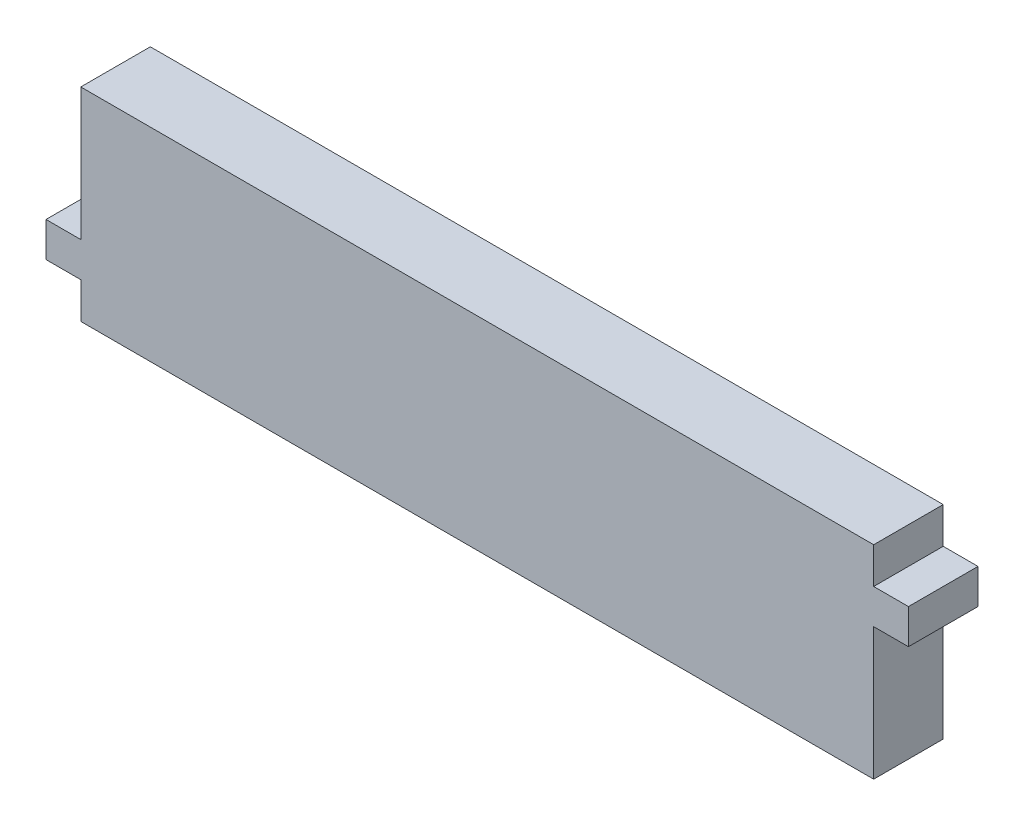
ISO-10303-21;
HEADER;
FILE_DESCRIPTION(('STEP AP214'),'2;1');
FILE_NAME('part.step','',(''),(''),'','','');
FILE_SCHEMA(('AUTOMOTIVE_DESIGN { 1 0 10303 214 1 1 1 1 }'));
ENDSEC;
DATA;
#1=APPLICATION_CONTEXT('core data for automotive mechanical design processes');
#2=APPLICATION_PROTOCOL_DEFINITION('international standard','automotive_design',2000,#1);
#3=PRODUCT_CONTEXT('',#1,'mechanical');
#4=PRODUCT('Part','Part','',(#3));
#5=PRODUCT_RELATED_PRODUCT_CATEGORY('part','',(#4));
#6=PRODUCT_DEFINITION_FORMATION('','',#4);
#7=PRODUCT_DEFINITION_CONTEXT('part definition',#1,'design');
#8=PRODUCT_DEFINITION('design','',#6,#7);
#9=PRODUCT_DEFINITION_SHAPE('','',#8);
#10=(LENGTH_UNIT() NAMED_UNIT(*) SI_UNIT(.MILLI.,.METRE.));
#11=(NAMED_UNIT(*) PLANE_ANGLE_UNIT() SI_UNIT($,.RADIAN.));
#12=(NAMED_UNIT(*) SI_UNIT($,.STERADIAN.) SOLID_ANGLE_UNIT());
#13=UNCERTAINTY_MEASURE_WITH_UNIT(LENGTH_MEASURE(1.E-05),#10,'distance_accuracy_value','');
#14=(GEOMETRIC_REPRESENTATION_CONTEXT(3) GLOBAL_UNCERTAINTY_ASSIGNED_CONTEXT((#13)) GLOBAL_UNIT_ASSIGNED_CONTEXT((#10,
#11,#12)) REPRESENTATION_CONTEXT('',''));
#15=CARTESIAN_POINT('',(0.,0.,0.));
#16=DIRECTION('',(0.,0.,1.));
#17=DIRECTION('',(1.,0.,0.));
#18=AXIS2_PLACEMENT_3D('',#15,#16,#17);
#19=CARTESIAN_POINT('',(129.113772097214,-14.4852674981757,87.2437164679681));
#20=DIRECTION('',(-1.,0.,0.));
#21=DIRECTION('',(0.,0.,1.));
#22=AXIS2_PLACEMENT_3D('',#19,#20,#21);
#23=PLANE('',#22);
#24=DIRECTION('',(0.,1.,0.));
#25=VECTOR('',#24,1.);
#26=CARTESIAN_POINT('',(129.113772097214,-14.4852674981757,6.35000000000004));
#27=LINE('',#26,#25);
#28=CARTESIAN_POINT('',(129.113772097214,-14.4852674981757,6.35000000000004));
#29=VERTEX_POINT('',#28);
#30=CARTESIAN_POINT('',(129.113772097214,-11.1832674981757,6.35000000000004));
#31=VERTEX_POINT('',#30);
#32=EDGE_CURVE('E167',#29,#31,#27,.T.);
#33=ORIENTED_EDGE('',*,*,#32,.F.);
#34=DIRECTION('',(0.,0.,-1.));
#35=VECTOR('',#34,1.);
#36=CARTESIAN_POINT('',(129.113772097214,-14.4852674981757,87.2437164679681));
#37=LINE('',#36,#35);
#38=CARTESIAN_POINT('',(129.113772097214,-14.4852674981757,0.));
#39=VERTEX_POINT('',#38);
#40=EDGE_CURVE('E36',#29,#39,#37,.T.);
#41=ORIENTED_EDGE('',*,*,#40,.T.);
#42=DIRECTION('',(0.,1.,0.));
#43=VECTOR('',#42,1.);
#44=CARTESIAN_POINT('',(129.113772097214,-14.4852674981757,0.));
#45=LINE('',#44,#43);
#46=CARTESIAN_POINT('',(129.113772097214,-11.1832674981757,0.));
#47=VERTEX_POINT('',#46);
#48=EDGE_CURVE('E175',#39,#47,#45,.T.);
#49=ORIENTED_EDGE('',*,*,#48,.T.);
#50=DIRECTION('',(0.,0.,-1.));
#51=VECTOR('',#50,1.);
#52=CARTESIAN_POINT('',(129.113772097214,-11.1832674981757,87.2437164679681));
#53=LINE('',#52,#51);
#54=EDGE_CURVE('E103',#31,#47,#53,.T.);
#55=ORIENTED_EDGE('',*,*,#54,.F.);
#56=EDGE_LOOP('',(#33,#41,#49,#55));
#57=FACE_BOUND('',#56,.T.);
#58=ADVANCED_FACE('F32',(#57),#23,.F.);
#59=CARTESIAN_POINT('',(56.7237720972143,-11.1832674981757,87.2437164679681));
#60=DIRECTION('',(0.,-1.,0.));
#61=DIRECTION('',(0.,0.,-1.));
#62=AXIS2_PLACEMENT_3D('',#59,#60,#61);
#63=PLANE('',#62);
#64=DIRECTION('',(-1.,0.,0.));
#65=VECTOR('',#64,1.);
#66=CARTESIAN_POINT('',(56.7237720972143,-11.1832674981757,6.35000000000004));
#67=LINE('',#66,#65);
#68=CARTESIAN_POINT('',(56.7237720972143,-11.1832674981757,6.35000000000004));
#69=VERTEX_POINT('',#68);
#70=EDGE_CURVE('E110',#31,#69,#67,.T.);
#71=ORIENTED_EDGE('',*,*,#70,.F.);
#72=ORIENTED_EDGE('',*,*,#54,.T.);
#73=DIRECTION('',(-1.,0.,0.));
#74=VECTOR('',#73,1.);
#75=CARTESIAN_POINT('',(56.7237720972143,-11.1832674981757,0.));
#76=LINE('',#75,#74);
#77=CARTESIAN_POINT('',(56.7237720972143,-11.1832674981757,0.));
#78=VERTEX_POINT('',#77);
#79=EDGE_CURVE('E174',#47,#78,#76,.T.);
#80=ORIENTED_EDGE('',*,*,#79,.T.);
#81=DIRECTION('',(0.,0.,-1.));
#82=VECTOR('',#81,1.);
#83=CARTESIAN_POINT('',(56.7237720972143,-11.1832674981757,87.2437164679681));
#84=LINE('',#83,#82);
#85=EDGE_CURVE('E176',#69,#78,#84,.T.);
#86=ORIENTED_EDGE('',*,*,#85,.F.);
#87=EDGE_LOOP('',(#71,#72,#80,#86));
#88=FACE_BOUND('',#87,.T.);
#89=ADVANCED_FACE('F225',(#88),#63,.F.);
#90=CARTESIAN_POINT('',(56.7237720972143,-23.2482674981758,87.2437164679681));
#91=DIRECTION('',(1.,0.,0.));
#92=DIRECTION('',(0.,0.,-1.));
#93=AXIS2_PLACEMENT_3D('',#90,#91,#92);
#94=PLANE('',#93);
#95=DIRECTION('',(0.,-1.,0.));
#96=VECTOR('',#95,1.);
#97=CARTESIAN_POINT('',(56.7237720972143,-23.2482674981758,6.35000000000004));
#98=LINE('',#97,#96);
#99=CARTESIAN_POINT('',(56.7237720972143,-23.2482674981758,6.35000000000004));
#100=VERTEX_POINT('',#99);
#101=EDGE_CURVE('E163',#69,#100,#98,.T.);
#102=ORIENTED_EDGE('',*,*,#101,.F.);
#103=ORIENTED_EDGE('',*,*,#85,.T.);
#104=DIRECTION('',(0.,-1.,0.));
#105=VECTOR('',#104,1.);
#106=CARTESIAN_POINT('',(56.7237720972143,-23.2482674981758,0.));
#107=LINE('',#106,#105);
#108=CARTESIAN_POINT('',(56.7237720972143,-23.2482674981758,0.));
#109=VERTEX_POINT('',#108);
#110=EDGE_CURVE('E178',#78,#109,#107,.T.);
#111=ORIENTED_EDGE('',*,*,#110,.T.);
#112=DIRECTION('',(0.,0.,-1.));
#113=VECTOR('',#112,1.);
#114=CARTESIAN_POINT('',(56.7237720972143,-23.2482674981758,87.2437164679681));
#115=LINE('',#114,#113);
#116=EDGE_CURVE('E179',#100,#109,#115,.T.);
#117=ORIENTED_EDGE('',*,*,#116,.F.);
#118=EDGE_LOOP('',(#102,#103,#111,#117));
#119=FACE_BOUND('',#118,.T.);
#120=ADVANCED_FACE('F228',(#119),#94,.F.);
#121=CARTESIAN_POINT('',(56.7237720972143,-23.2482674981758,87.2437164679681));
#122=DIRECTION('',(0.,-1.,0.));
#123=DIRECTION('',(0.,0.,-1.));
#124=AXIS2_PLACEMENT_3D('',#121,#122,#123);
#125=PLANE('',#124);
#126=DIRECTION('',(-1.,0.,0.));
#127=VECTOR('',#126,1.);
#128=CARTESIAN_POINT('',(56.7237720972143,-23.2482674981758,6.35000000000004));
#129=LINE('',#128,#127);
#130=CARTESIAN_POINT('',(53.5487720972143,-23.2482674981758,6.35000000000004));
#131=VERTEX_POINT('',#130);
#132=EDGE_CURVE('E160',#100,#131,#129,.T.);
#133=ORIENTED_EDGE('',*,*,#132,.F.);
#134=ORIENTED_EDGE('',*,*,#116,.T.);
#135=DIRECTION('',(-1.,0.,0.));
#136=VECTOR('',#135,1.);
#137=CARTESIAN_POINT('',(56.7237720972143,-23.2482674981758,0.));
#138=LINE('',#137,#136);
#139=CARTESIAN_POINT('',(53.5487720972143,-23.2482674981758,0.));
#140=VERTEX_POINT('',#139);
#141=EDGE_CURVE('E181',#109,#140,#138,.T.);
#142=ORIENTED_EDGE('',*,*,#141,.T.);
#143=DIRECTION('',(0.,0.,-1.));
#144=VECTOR('',#143,1.);
#145=CARTESIAN_POINT('',(53.5487720972143,-23.2482674981758,87.2437164679681));
#146=LINE('',#145,#144);
#147=EDGE_CURVE('E182',#131,#140,#146,.T.);
#148=ORIENTED_EDGE('',*,*,#147,.F.);
#149=EDGE_LOOP('',(#133,#134,#142,#148));
#150=FACE_BOUND('',#149,.T.);
#151=ADVANCED_FACE('F230',(#150),#125,.F.);
#152=CARTESIAN_POINT('',(53.5487720972143,-23.2482674981758,87.2437164679681));
#153=DIRECTION('',(1.,0.,0.));
#154=DIRECTION('',(0.,0.,-1.));
#155=AXIS2_PLACEMENT_3D('',#152,#153,#154);
#156=PLANE('',#155);
#157=DIRECTION('',(0.,-1.,0.));
#158=VECTOR('',#157,1.);
#159=CARTESIAN_POINT('',(53.5487720972143,-23.2482674981758,6.35000000000004));
#160=LINE('',#159,#158);
#161=CARTESIAN_POINT('',(53.5487720972143,-26.4232674981758,6.35000000000004));
#162=VERTEX_POINT('',#161);
#163=EDGE_CURVE('E157',#131,#162,#160,.T.);
#164=ORIENTED_EDGE('',*,*,#163,.F.);
#165=ORIENTED_EDGE('',*,*,#147,.T.);
#166=DIRECTION('',(0.,-1.,0.));
#167=VECTOR('',#166,1.);
#168=CARTESIAN_POINT('',(53.5487720972143,-23.2482674981758,0.));
#169=LINE('',#168,#167);
#170=CARTESIAN_POINT('',(53.5487720972143,-26.4232674981758,0.));
#171=VERTEX_POINT('',#170);
#172=EDGE_CURVE('E184',#140,#171,#169,.T.);
#173=ORIENTED_EDGE('',*,*,#172,.T.);
#174=DIRECTION('',(0.,0.,-1.));
#175=VECTOR('',#174,1.);
#176=CARTESIAN_POINT('',(53.5487720972143,-26.4232674981758,87.2437164679681));
#177=LINE('',#176,#175);
#178=EDGE_CURVE('E185',#162,#171,#177,.T.);
#179=ORIENTED_EDGE('',*,*,#178,.F.);
#180=EDGE_LOOP('',(#164,#165,#173,#179));
#181=FACE_BOUND('',#180,.T.);
#182=ADVANCED_FACE('F234',(#181),#156,.F.);
#183=CARTESIAN_POINT('',(53.5487720972143,-26.4232674981758,87.2437164679681));
#184=DIRECTION('',(0.,1.,0.));
#185=DIRECTION('',(0.,0.,1.));
#186=AXIS2_PLACEMENT_3D('',#183,#184,#185);
#187=PLANE('',#186);
#188=DIRECTION('',(1.,0.,0.));
#189=VECTOR('',#188,1.);
#190=CARTESIAN_POINT('',(53.5487720972143,-26.4232674981758,6.35000000000004));
#191=LINE('',#190,#189);
#192=CARTESIAN_POINT('',(56.7237720972143,-26.4232674981758,6.35000000000004));
#193=VERTEX_POINT('',#192);
#194=EDGE_CURVE('E154',#162,#193,#191,.T.);
#195=ORIENTED_EDGE('',*,*,#194,.F.);
#196=ORIENTED_EDGE('',*,*,#178,.T.);
#197=DIRECTION('',(1.,0.,0.));
#198=VECTOR('',#197,1.);
#199=CARTESIAN_POINT('',(53.5487720972143,-26.4232674981758,0.));
#200=LINE('',#199,#198);
#201=CARTESIAN_POINT('',(56.7237720972143,-26.4232674981758,0.));
#202=VERTEX_POINT('',#201);
#203=EDGE_CURVE('E187',#171,#202,#200,.T.);
#204=ORIENTED_EDGE('',*,*,#203,.T.);
#205=DIRECTION('',(0.,0.,-1.));
#206=VECTOR('',#205,1.);
#207=CARTESIAN_POINT('',(56.7237720972143,-26.4232674981758,87.2437164679681));
#208=LINE('',#207,#206);
#209=EDGE_CURVE('E188',#193,#202,#208,.T.);
#210=ORIENTED_EDGE('',*,*,#209,.F.);
#211=EDGE_LOOP('',(#195,#196,#204,#210));
#212=FACE_BOUND('',#211,.T.);
#213=ADVANCED_FACE('F239',(#212),#187,.F.);
#214=CARTESIAN_POINT('',(56.7237720972143,-26.4232674981758,87.2437164679681));
#215=DIRECTION('',(1.,0.,0.));
#216=DIRECTION('',(0.,0.,-1.));
#217=AXIS2_PLACEMENT_3D('',#214,#215,#216);
#218=PLANE('',#217);
#219=DIRECTION('',(0.,-1.,0.));
#220=VECTOR('',#219,1.);
#221=CARTESIAN_POINT('',(56.7237720972143,-26.4232674981758,6.35000000000004));
#222=LINE('',#221,#220);
#223=CARTESIAN_POINT('',(56.7237720972143,-29.7252674981758,6.35000000000004));
#224=VERTEX_POINT('',#223);
#225=EDGE_CURVE('E151',#193,#224,#222,.T.);
#226=ORIENTED_EDGE('',*,*,#225,.F.);
#227=ORIENTED_EDGE('',*,*,#209,.T.);
#228=DIRECTION('',(0.,-1.,0.));
#229=VECTOR('',#228,1.);
#230=CARTESIAN_POINT('',(56.7237720972143,-26.4232674981758,0.));
#231=LINE('',#230,#229);
#232=CARTESIAN_POINT('',(56.7237720972143,-29.7252674981758,0.));
#233=VERTEX_POINT('',#232);
#234=EDGE_CURVE('E190',#202,#233,#231,.T.);
#235=ORIENTED_EDGE('',*,*,#234,.T.);
#236=DIRECTION('',(0.,0.,-1.));
#237=VECTOR('',#236,1.);
#238=CARTESIAN_POINT('',(56.7237720972143,-29.7252674981758,87.2437164679681));
#239=LINE('',#238,#237);
#240=EDGE_CURVE('E191',#224,#233,#239,.T.);
#241=ORIENTED_EDGE('',*,*,#240,.F.);
#242=EDGE_LOOP('',(#226,#227,#235,#241));
#243=FACE_BOUND('',#242,.T.);
#244=ADVANCED_FACE('F242',(#243),#218,.F.);
#245=CARTESIAN_POINT('',(56.7237720972143,-29.7252674981758,87.2437164679681));
#246=DIRECTION('',(0.,1.,0.));
#247=DIRECTION('',(0.,0.,1.));
#248=AXIS2_PLACEMENT_3D('',#245,#246,#247);
#249=PLANE('',#248);
#250=DIRECTION('',(1.,0.,0.));
#251=VECTOR('',#250,1.);
#252=CARTESIAN_POINT('',(56.7237720972143,-29.7252674981758,6.35000000000004));
#253=LINE('',#252,#251);
#254=CARTESIAN_POINT('',(129.113772097214,-29.7252674981758,6.35000000000004));
#255=VERTEX_POINT('',#254);
#256=EDGE_CURVE('E146',#224,#255,#253,.T.);
#257=ORIENTED_EDGE('',*,*,#256,.F.);
#258=ORIENTED_EDGE('',*,*,#240,.T.);
#259=DIRECTION('',(1.,0.,0.));
#260=VECTOR('',#259,1.);
#261=CARTESIAN_POINT('',(56.7237720972143,-29.7252674981758,0.));
#262=LINE('',#261,#260);
#263=CARTESIAN_POINT('',(129.113772097214,-29.7252674981758,0.));
#264=VERTEX_POINT('',#263);
#265=EDGE_CURVE('E193',#233,#264,#262,.T.);
#266=ORIENTED_EDGE('',*,*,#265,.T.);
#267=DIRECTION('',(0.,0.,-1.));
#268=VECTOR('',#267,1.);
#269=CARTESIAN_POINT('',(129.113772097214,-29.7252674981758,87.2437164679681));
#270=LINE('',#269,#268);
#271=EDGE_CURVE('E194',#255,#264,#270,.T.);
#272=ORIENTED_EDGE('',*,*,#271,.F.);
#273=EDGE_LOOP('',(#257,#258,#266,#272));
#274=FACE_BOUND('',#273,.T.);
#275=ADVANCED_FACE('F246',(#274),#249,.F.);
#276=CARTESIAN_POINT('',(129.113772097214,-17.6602674981757,87.2437164679681));
#277=DIRECTION('',(-1.,0.,0.));
#278=DIRECTION('',(0.,0.,1.));
#279=AXIS2_PLACEMENT_3D('',#276,#277,#278);
#280=PLANE('',#279);
#281=DIRECTION('',(0.,1.,0.));
#282=VECTOR('',#281,1.);
#283=CARTESIAN_POINT('',(129.113772097214,-17.6602674981757,6.35000000000004));
#284=LINE('',#283,#282);
#285=CARTESIAN_POINT('',(129.113772097214,-17.6602674981757,6.35000000000004));
#286=VERTEX_POINT('',#285);
#287=EDGE_CURVE('E144',#255,#286,#284,.T.);
#288=ORIENTED_EDGE('',*,*,#287,.F.);
#289=ORIENTED_EDGE('',*,*,#271,.T.);
#290=DIRECTION('',(0.,1.,0.));
#291=VECTOR('',#290,1.);
#292=CARTESIAN_POINT('',(129.113772097214,-17.6602674981757,0.));
#293=LINE('',#292,#291);
#294=CARTESIAN_POINT('',(129.113772097214,-17.6602674981757,0.));
#295=VERTEX_POINT('',#294);
#296=EDGE_CURVE('E196',#264,#295,#293,.T.);
#297=ORIENTED_EDGE('',*,*,#296,.T.);
#298=DIRECTION('',(0.,0.,-1.));
#299=VECTOR('',#298,1.);
#300=CARTESIAN_POINT('',(129.113772097214,-17.6602674981757,87.2437164679681));
#301=LINE('',#300,#299);
#302=EDGE_CURVE('E197',#286,#295,#301,.T.);
#303=ORIENTED_EDGE('',*,*,#302,.F.);
#304=EDGE_LOOP('',(#288,#289,#297,#303));
#305=FACE_BOUND('',#304,.T.);
#306=ADVANCED_FACE('F250',(#305),#280,.F.);
#307=CARTESIAN_POINT('',(132.288772097214,-17.6602674981757,87.2437164679681));
#308=DIRECTION('',(0.,1.,0.));
#309=DIRECTION('',(0.,0.,1.));
#310=AXIS2_PLACEMENT_3D('',#307,#308,#309);
#311=PLANE('',#310);
#312=DIRECTION('',(1.,0.,0.));
#313=VECTOR('',#312,1.);
#314=CARTESIAN_POINT('',(132.288772097214,-17.6602674981757,6.35000000000004));
#315=LINE('',#314,#313);
#316=CARTESIAN_POINT('',(132.288772097214,-17.6602674981757,6.35000000000004));
#317=VERTEX_POINT('',#316);
#318=EDGE_CURVE('E41',#286,#317,#315,.T.);
#319=ORIENTED_EDGE('',*,*,#318,.F.);
#320=ORIENTED_EDGE('',*,*,#302,.T.);
#321=DIRECTION('',(1.,0.,0.));
#322=VECTOR('',#321,1.);
#323=CARTESIAN_POINT('',(132.288772097214,-17.6602674981757,0.));
#324=LINE('',#323,#322);
#325=CARTESIAN_POINT('',(132.288772097214,-17.6602674981757,0.));
#326=VERTEX_POINT('',#325);
#327=EDGE_CURVE('E138',#295,#326,#324,.T.);
#328=ORIENTED_EDGE('',*,*,#327,.T.);
#329=DIRECTION('',(0.,0.,-1.));
#330=VECTOR('',#329,1.);
#331=CARTESIAN_POINT('',(132.288772097214,-17.6602674981757,87.2437164679681));
#332=LINE('',#331,#330);
#333=EDGE_CURVE('E129',#317,#326,#332,.T.);
#334=ORIENTED_EDGE('',*,*,#333,.F.);
#335=EDGE_LOOP('',(#319,#320,#328,#334));
#336=FACE_BOUND('',#335,.T.);
#337=ADVANCED_FACE('F135',(#336),#311,.F.);
#338=CARTESIAN_POINT('',(132.288772097214,-14.4852674981757,87.2437164679681));
#339=DIRECTION('',(-1.,0.,0.));
#340=DIRECTION('',(0.,0.,1.));
#341=AXIS2_PLACEMENT_3D('',#338,#339,#340);
#342=PLANE('',#341);
#343=DIRECTION('',(0.,1.,0.));
#344=VECTOR('',#343,1.);
#345=CARTESIAN_POINT('',(132.288772097214,-14.4852674981757,6.35000000000004));
#346=LINE('',#345,#344);
#347=CARTESIAN_POINT('',(132.288772097214,-14.4852674981757,6.35000000000004));
#348=VERTEX_POINT('',#347);
#349=EDGE_CURVE('E11',#317,#348,#346,.T.);
#350=ORIENTED_EDGE('',*,*,#349,.F.);
#351=ORIENTED_EDGE('',*,*,#333,.T.);
#352=DIRECTION('',(0.,1.,0.));
#353=VECTOR('',#352,1.);
#354=CARTESIAN_POINT('',(132.288772097214,-14.4852674981757,0.));
#355=LINE('',#354,#353);
#356=CARTESIAN_POINT('',(132.288772097214,-14.4852674981757,0.));
#357=VERTEX_POINT('',#356);
#358=EDGE_CURVE('E140',#326,#357,#355,.T.);
#359=ORIENTED_EDGE('',*,*,#358,.T.);
#360=DIRECTION('',(0.,0.,-1.));
#361=VECTOR('',#360,1.);
#362=CARTESIAN_POINT('',(132.288772097214,-14.4852674981757,87.2437164679681));
#363=LINE('',#362,#361);
#364=EDGE_CURVE('E54',#348,#357,#363,.T.);
#365=ORIENTED_EDGE('',*,*,#364,.F.);
#366=EDGE_LOOP('',(#350,#351,#359,#365));
#367=FACE_BOUND('',#366,.T.);
#368=ADVANCED_FACE('F128',(#367),#342,.F.);
#369=CARTESIAN_POINT('',(129.113772097214,-14.4852674981757,87.2437164679681));
#370=DIRECTION('',(0.,-1.,0.));
#371=DIRECTION('',(0.,0.,-1.));
#372=AXIS2_PLACEMENT_3D('',#369,#370,#371);
#373=PLANE('',#372);
#374=DIRECTION('',(-1.,0.,0.));
#375=VECTOR('',#374,1.);
#376=CARTESIAN_POINT('',(129.113772097214,-14.4852674981757,6.35000000000004));
#377=LINE('',#376,#375);
#378=EDGE_CURVE('E170',#348,#29,#377,.T.);
#379=ORIENTED_EDGE('',*,*,#378,.F.);
#380=ORIENTED_EDGE('',*,*,#364,.T.);
#381=DIRECTION('',(-1.,0.,0.));
#382=VECTOR('',#381,1.);
#383=CARTESIAN_POINT('',(129.113772097214,-14.4852674981757,0.));
#384=LINE('',#383,#382);
#385=EDGE_CURVE('E172',#357,#39,#384,.T.);
#386=ORIENTED_EDGE('',*,*,#385,.T.);
#387=ORIENTED_EDGE('',*,*,#40,.F.);
#388=EDGE_LOOP('',(#379,#380,#386,#387));
#389=FACE_BOUND('',#388,.T.);
#390=ADVANCED_FACE('F220',(#389),#373,.F.);
#391=CARTESIAN_POINT('',(0.,0.,0.));
#392=DIRECTION('',(0.,0.,-1.));
#393=DIRECTION('',(-1.,0.,0.));
#394=AXIS2_PLACEMENT_3D('',#391,#392,#393);
#395=PLANE('',#394);
#396=ORIENTED_EDGE('',*,*,#48,.F.);
#397=ORIENTED_EDGE('',*,*,#385,.F.);
#398=ORIENTED_EDGE('',*,*,#358,.F.);
#399=ORIENTED_EDGE('',*,*,#327,.F.);
#400=ORIENTED_EDGE('',*,*,#296,.F.);
#401=ORIENTED_EDGE('',*,*,#265,.F.);
#402=ORIENTED_EDGE('',*,*,#234,.F.);
#403=ORIENTED_EDGE('',*,*,#203,.F.);
#404=ORIENTED_EDGE('',*,*,#172,.F.);
#405=ORIENTED_EDGE('',*,*,#141,.F.);
#406=ORIENTED_EDGE('',*,*,#110,.F.);
#407=ORIENTED_EDGE('',*,*,#79,.F.);
#408=EDGE_LOOP('',(#396,#397,#398,#399,#400,#401,#402,#403,#404,#405,#406,#407));
#409=FACE_BOUND('',#408,.T.);
#410=ADVANCED_FACE('F222',(#409),#395,.T.);
#411=CARTESIAN_POINT('',(283.54158093923,-17.6602674981757,6.35000000000004));
#412=DIRECTION('',(0.,0.,1.));
#413=DIRECTION('',(1.,0.,0.));
#414=AXIS2_PLACEMENT_3D('',#411,#412,#413);
#415=PLANE('',#414);
#416=ORIENTED_EDGE('',*,*,#378,.T.);
#417=ORIENTED_EDGE('',*,*,#32,.T.);
#418=ORIENTED_EDGE('',*,*,#70,.T.);
#419=ORIENTED_EDGE('',*,*,#101,.T.);
#420=ORIENTED_EDGE('',*,*,#132,.T.);
#421=ORIENTED_EDGE('',*,*,#163,.T.);
#422=ORIENTED_EDGE('',*,*,#194,.T.);
#423=ORIENTED_EDGE('',*,*,#225,.T.);
#424=ORIENTED_EDGE('',*,*,#256,.T.);
#425=ORIENTED_EDGE('',*,*,#287,.T.);
#426=ORIENTED_EDGE('',*,*,#318,.T.);
#427=ORIENTED_EDGE('',*,*,#349,.T.);
#428=EDGE_LOOP('',(#416,#417,#418,#419,#420,#421,#422,#423,#424,#425,#426,#427));
#429=FACE_BOUND('',#428,.T.);
#430=ADVANCED_FACE('F34',(#429),#415,.T.);
#431=CLOSED_SHELL('',(#58,#89,#120,#151,#182,#213,#244,#275,#306,#337,#368,#390,#410,#430));
#432=MANIFOLD_SOLID_BREP('B2',#431);
#433=ADVANCED_BREP_SHAPE_REPRESENTATION('',(#18,#432),#14);
#434=SHAPE_DEFINITION_REPRESENTATION(#9,#433);
ENDSEC;
END-ISO-10303-21;
